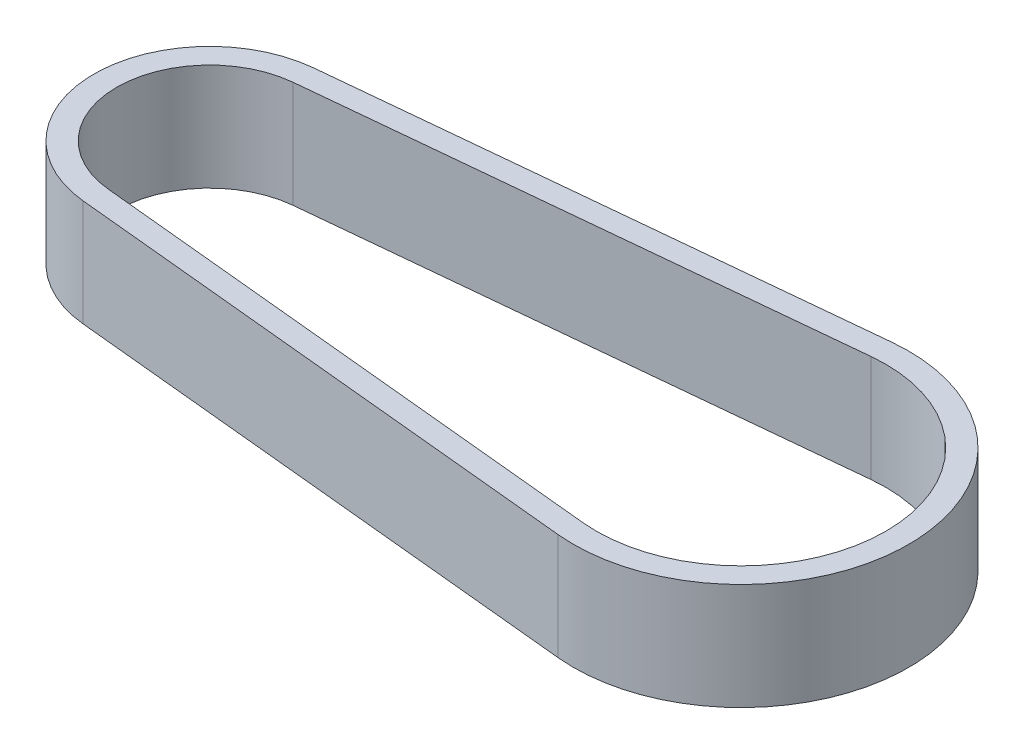
ISO-10303-21;
HEADER;
FILE_DESCRIPTION(('STEP AP214'),'2;1');
FILE_NAME('part.step','',(''),(''),'','','');
FILE_SCHEMA(('AUTOMOTIVE_DESIGN { 1 0 10303 214 1 1 1 1 }'));
ENDSEC;
DATA;
#1=APPLICATION_CONTEXT('core data for automotive mechanical design processes');
#2=APPLICATION_PROTOCOL_DEFINITION('international standard','automotive_design',2000,#1);
#3=PRODUCT_CONTEXT('',#1,'mechanical');
#4=PRODUCT('Part','Part','',(#3));
#5=PRODUCT_RELATED_PRODUCT_CATEGORY('part','',(#4));
#6=PRODUCT_DEFINITION_FORMATION('','',#4);
#7=PRODUCT_DEFINITION_CONTEXT('part definition',#1,'design');
#8=PRODUCT_DEFINITION('design','',#6,#7);
#9=PRODUCT_DEFINITION_SHAPE('','',#8);
#10=(LENGTH_UNIT() NAMED_UNIT(*) SI_UNIT(.MILLI.,.METRE.));
#11=(NAMED_UNIT(*) PLANE_ANGLE_UNIT() SI_UNIT($,.RADIAN.));
#12=(NAMED_UNIT(*) SI_UNIT($,.STERADIAN.) SOLID_ANGLE_UNIT());
#13=UNCERTAINTY_MEASURE_WITH_UNIT(LENGTH_MEASURE(1.E-05),#10,'distance_accuracy_value','');
#14=(GEOMETRIC_REPRESENTATION_CONTEXT(3) GLOBAL_UNCERTAINTY_ASSIGNED_CONTEXT((#13)) GLOBAL_UNIT_ASSIGNED_CONTEXT((#10,
#11,#12)) REPRESENTATION_CONTEXT('',''));
#15=CARTESIAN_POINT('',(0.,0.,0.));
#16=DIRECTION('',(0.,0.,1.));
#17=DIRECTION('',(1.,0.,0.));
#18=AXIS2_PLACEMENT_3D('',#15,#16,#17);
#19=CARTESIAN_POINT('',(0.,7.,0.));
#20=DIRECTION('',(0.,1.,0.));
#21=DIRECTION('',(0.,0.,1.));
#22=AXIS2_PLACEMENT_3D('',#19,#20,#21);
#23=PLANE('',#22);
#24=CARTESIAN_POINT('',(0.,7.,0.));
#25=DIRECTION('',(0.,1.,0.));
#26=DIRECTION('',(0.,0.,1.));
#27=AXIS2_PLACEMENT_3D('',#24,#25,#26);
#28=CIRCLE('',#27,7.6);
#29=CARTESIAN_POINT('',(-0.740401146131805,7.,-7.56384863299145));
#30=VERTEX_POINT('',#29);
#31=CARTESIAN_POINT('',(-0.740401146131804,7.,7.56384863299145));
#32=VERTEX_POINT('',#31);
#33=EDGE_CURVE('E134',#30,#32,#28,.T.);
#34=ORIENTED_EDGE('',*,*,#33,.T.);
#35=DIRECTION('',(0.995243241183086,0.,0.0974212034383954));
#36=VECTOR('',#35,1.);
#37=CARTESIAN_POINT('',(-0.740401146131804,7.,7.56384863299145));
#38=LINE('',#37,#36);
#39=CARTESIAN_POINT('',(33.8283667621776,7.,10.9476756530139));
#40=VERTEX_POINT('',#39);
#41=EDGE_CURVE('E137',#32,#40,#38,.T.);
#42=ORIENTED_EDGE('',*,*,#41,.T.);
#43=CARTESIAN_POINT('',(34.9,7.,0.));
#44=DIRECTION('',(0.,1.,0.));
#45=DIRECTION('',(0.,0.,1.));
#46=AXIS2_PLACEMENT_3D('',#43,#44,#45);
#47=CIRCLE('',#46,11.);
#48=CARTESIAN_POINT('',(33.8283667621777,7.,-10.9476756530139));
#49=VERTEX_POINT('',#48);
#50=EDGE_CURVE('E140',#40,#49,#47,.T.);
#51=ORIENTED_EDGE('',*,*,#50,.T.);
#52=DIRECTION('',(-0.995243241183086,0.,0.0974212034383955));
#53=VECTOR('',#52,1.);
#54=CARTESIAN_POINT('',(-0.740401146131805,7.,-7.56384863299145));
#55=LINE('',#54,#53);
#56=EDGE_CURVE('E142',#49,#30,#55,.T.);
#57=ORIENTED_EDGE('',*,*,#56,.T.);
#58=EDGE_LOOP('',(#34,#42,#51,#57));
#59=FACE_BOUND('',#58,.T.);
#60=DIRECTION('',(0.995243241183086,0.,0.0974212034383954));
#61=VECTOR('',#60,1.);
#62=CARTESIAN_POINT('',(-0.594269340974212,7.,6.07098377121683));
#63=LINE('',#62,#61);
#64=CARTESIAN_POINT('',(-0.594269340974212,7.,6.07098377121683));
#65=VERTEX_POINT('',#64);
#66=CARTESIAN_POINT('',(33.9744985673352,7.,9.45481079123932));
#67=VERTEX_POINT('',#66);
#68=EDGE_CURVE('E106',#65,#67,#63,.T.);
#69=ORIENTED_EDGE('',*,*,#68,.F.);
#70=CARTESIAN_POINT('',(0.,7.,0.));
#71=DIRECTION('',(0.,1.,0.));
#72=DIRECTION('',(0.,0.,1.));
#73=AXIS2_PLACEMENT_3D('',#70,#71,#72);
#74=CIRCLE('',#73,6.1);
#75=CARTESIAN_POINT('',(-0.594269340974212,7.,-6.07098377121683));
#76=VERTEX_POINT('',#75);
#77=EDGE_CURVE('E98',#76,#65,#74,.T.);
#78=ORIENTED_EDGE('',*,*,#77,.F.);
#79=DIRECTION('',(-0.995243241183086,0.,0.0974212034383954));
#80=VECTOR('',#79,1.);
#81=CARTESIAN_POINT('',(-0.594269340974212,7.,-6.07098377121683));
#82=LINE('',#81,#80);
#83=CARTESIAN_POINT('',(33.9744985673352,7.,-9.45481079123932));
#84=VERTEX_POINT('',#83);
#85=EDGE_CURVE('E120',#84,#76,#82,.T.);
#86=ORIENTED_EDGE('',*,*,#85,.F.);
#87=CARTESIAN_POINT('',(34.9,7.,0.));
#88=DIRECTION('',(0.,1.,0.));
#89=DIRECTION('',(0.,0.,1.));
#90=AXIS2_PLACEMENT_3D('',#87,#88,#89);
#91=CIRCLE('',#90,9.5);
#92=EDGE_CURVE('E118',#67,#84,#91,.T.);
#93=ORIENTED_EDGE('',*,*,#92,.F.);
#94=EDGE_LOOP('',(#69,#78,#86,#93));
#95=FACE_BOUND('',#94,.T.);
#96=ADVANCED_FACE('F33',(#59,#95),#23,.T.);
#97=CARTESIAN_POINT('',(0.,0.,0.));
#98=DIRECTION('',(0.,1.,0.));
#99=DIRECTION('',(0.,0.,1.));
#100=AXIS2_PLACEMENT_3D('',#97,#98,#99);
#101=PLANE('',#100);
#102=CARTESIAN_POINT('',(0.,0.,0.));
#103=DIRECTION('',(0.,1.,0.));
#104=DIRECTION('',(0.,0.,1.));
#105=AXIS2_PLACEMENT_3D('',#102,#103,#104);
#106=CIRCLE('',#105,7.6);
#107=CARTESIAN_POINT('',(-0.740401146131805,0.,-7.56384863299145));
#108=VERTEX_POINT('',#107);
#109=CARTESIAN_POINT('',(-0.740401146131804,0.,7.56384863299145));
#110=VERTEX_POINT('',#109);
#111=EDGE_CURVE('E114',#108,#110,#106,.T.);
#112=ORIENTED_EDGE('',*,*,#111,.F.);
#113=DIRECTION('',(-0.995243241183086,0.,0.0974212034383955));
#114=VECTOR('',#113,1.);
#115=CARTESIAN_POINT('',(-0.740401146131805,0.,-7.56384863299145));
#116=LINE('',#115,#114);
#117=CARTESIAN_POINT('',(33.8283667621777,0.,-10.9476756530139));
#118=VERTEX_POINT('',#117);
#119=EDGE_CURVE('E138',#118,#108,#116,.T.);
#120=ORIENTED_EDGE('',*,*,#119,.F.);
#121=CARTESIAN_POINT('',(34.9,0.,0.));
#122=DIRECTION('',(0.,1.,0.));
#123=DIRECTION('',(0.,0.,1.));
#124=AXIS2_PLACEMENT_3D('',#121,#122,#123);
#125=CIRCLE('',#124,11.);
#126=CARTESIAN_POINT('',(33.8283667621776,0.,10.9476756530139));
#127=VERTEX_POINT('',#126);
#128=EDGE_CURVE('E149',#127,#118,#125,.T.);
#129=ORIENTED_EDGE('',*,*,#128,.F.);
#130=DIRECTION('',(0.995243241183086,0.,0.0974212034383954));
#131=VECTOR('',#130,1.);
#132=CARTESIAN_POINT('',(-0.740401146131804,0.,7.56384863299145));
#133=LINE('',#132,#131);
#134=EDGE_CURVE('E147',#110,#127,#133,.T.);
#135=ORIENTED_EDGE('',*,*,#134,.F.);
#136=EDGE_LOOP('',(#112,#120,#129,#135));
#137=FACE_BOUND('',#136,.T.);
#138=CARTESIAN_POINT('',(0.,0.,0.));
#139=DIRECTION('',(0.,1.,0.));
#140=DIRECTION('',(0.,0.,1.));
#141=AXIS2_PLACEMENT_3D('',#138,#139,#140);
#142=CIRCLE('',#141,6.1);
#143=CARTESIAN_POINT('',(-0.594269340974212,0.,-6.07098377121683));
#144=VERTEX_POINT('',#143);
#145=CARTESIAN_POINT('',(-0.594269340974212,0.,6.07098377121683));
#146=VERTEX_POINT('',#145);
#147=EDGE_CURVE('E56',#144,#146,#142,.T.);
#148=ORIENTED_EDGE('',*,*,#147,.T.);
#149=DIRECTION('',(0.995243241183086,0.,0.0974212034383954));
#150=VECTOR('',#149,1.);
#151=CARTESIAN_POINT('',(-0.594269340974212,0.,6.07098377121683));
#152=LINE('',#151,#150);
#153=CARTESIAN_POINT('',(33.9744985673352,0.,9.45481079123932));
#154=VERTEX_POINT('',#153);
#155=EDGE_CURVE('E113',#146,#154,#152,.T.);
#156=ORIENTED_EDGE('',*,*,#155,.T.);
#157=CARTESIAN_POINT('',(34.9,0.,0.));
#158=DIRECTION('',(0.,1.,0.));
#159=DIRECTION('',(0.,0.,1.));
#160=AXIS2_PLACEMENT_3D('',#157,#158,#159);
#161=CIRCLE('',#160,9.5);
#162=CARTESIAN_POINT('',(33.9744985673352,0.,-9.45481079123932));
#163=VERTEX_POINT('',#162);
#164=EDGE_CURVE('E126',#154,#163,#161,.T.);
#165=ORIENTED_EDGE('',*,*,#164,.T.);
#166=DIRECTION('',(-0.995243241183086,0.,0.0974212034383954));
#167=VECTOR('',#166,1.);
#168=CARTESIAN_POINT('',(-0.594269340974212,0.,-6.07098377121683));
#169=LINE('',#168,#167);
#170=EDGE_CURVE('E107',#163,#144,#169,.T.);
#171=ORIENTED_EDGE('',*,*,#170,.T.);
#172=EDGE_LOOP('',(#148,#156,#165,#171));
#173=FACE_BOUND('',#172,.T.);
#174=ADVANCED_FACE('F167',(#137,#173),#101,.F.);
#175=CARTESIAN_POINT('',(0.,7.,0.));
#176=DIRECTION('',(0.,-1.,0.));
#177=DIRECTION('',(0.,0.,-1.));
#178=AXIS2_PLACEMENT_3D('',#175,#176,#177);
#179=CYLINDRICAL_SURFACE('',#178,7.6);
#180=ORIENTED_EDGE('',*,*,#111,.T.);
#181=DIRECTION('',(0.,-1.,0.));
#182=VECTOR('',#181,1.);
#183=CARTESIAN_POINT('',(-0.740401146131804,7.,7.56384863299145));
#184=LINE('',#183,#182);
#185=EDGE_CURVE('E11',#32,#110,#184,.T.);
#186=ORIENTED_EDGE('',*,*,#185,.F.);
#187=ORIENTED_EDGE('',*,*,#33,.F.);
#188=DIRECTION('',(0.,-1.,0.));
#189=VECTOR('',#188,1.);
#190=CARTESIAN_POINT('',(-0.740401146131805,7.,-7.56384863299145));
#191=LINE('',#190,#189);
#192=EDGE_CURVE('E144',#30,#108,#191,.T.);
#193=ORIENTED_EDGE('',*,*,#192,.T.);
#194=EDGE_LOOP('',(#180,#186,#187,#193));
#195=FACE_BOUND('',#194,.T.);
#196=ADVANCED_FACE('F35',(#195),#179,.T.);
#197=CARTESIAN_POINT('',(-0.740401146131804,7.,7.56384863299145));
#198=DIRECTION('',(0.0974212034383954,0.,-0.995243241183086));
#199=DIRECTION('',(-0.995243241183086,0.,-0.0974212034383954));
#200=AXIS2_PLACEMENT_3D('',#197,#198,#199);
#201=PLANE('',#200);
#202=ORIENTED_EDGE('',*,*,#134,.T.);
#203=DIRECTION('',(0.,-1.,0.));
#204=VECTOR('',#203,1.);
#205=CARTESIAN_POINT('',(33.8283667621776,7.,10.9476756530139));
#206=LINE('',#205,#204);
#207=EDGE_CURVE('E41',#40,#127,#206,.T.);
#208=ORIENTED_EDGE('',*,*,#207,.F.);
#209=ORIENTED_EDGE('',*,*,#41,.F.);
#210=ORIENTED_EDGE('',*,*,#185,.T.);
#211=EDGE_LOOP('',(#202,#208,#209,#210));
#212=FACE_BOUND('',#211,.T.);
#213=ADVANCED_FACE('F177',(#212),#201,.F.);
#214=CARTESIAN_POINT('',(34.9,7.,0.));
#215=DIRECTION('',(0.,-1.,0.));
#216=DIRECTION('',(0.,0.,-1.));
#217=AXIS2_PLACEMENT_3D('',#214,#215,#216);
#218=CYLINDRICAL_SURFACE('',#217,11.);
#219=ORIENTED_EDGE('',*,*,#128,.T.);
#220=DIRECTION('',(0.,-1.,0.));
#221=VECTOR('',#220,1.);
#222=CARTESIAN_POINT('',(33.8283667621777,7.,-10.9476756530139));
#223=LINE('',#222,#221);
#224=EDGE_CURVE('E154',#49,#118,#223,.T.);
#225=ORIENTED_EDGE('',*,*,#224,.F.);
#226=ORIENTED_EDGE('',*,*,#50,.F.);
#227=ORIENTED_EDGE('',*,*,#207,.T.);
#228=EDGE_LOOP('',(#219,#225,#226,#227));
#229=FACE_BOUND('',#228,.T.);
#230=ADVANCED_FACE('F161',(#229),#218,.T.);
#231=CARTESIAN_POINT('',(-0.740401146131805,7.,-7.56384863299145));
#232=DIRECTION('',(0.0974212034383954,0.,0.995243241183086));
#233=DIRECTION('',(0.995243241183086,0.,-0.0974212034383955));
#234=AXIS2_PLACEMENT_3D('',#231,#232,#233);
#235=PLANE('',#234);
#236=ORIENTED_EDGE('',*,*,#119,.T.);
#237=ORIENTED_EDGE('',*,*,#192,.F.);
#238=ORIENTED_EDGE('',*,*,#56,.F.);
#239=ORIENTED_EDGE('',*,*,#224,.T.);
#240=EDGE_LOOP('',(#236,#237,#238,#239));
#241=FACE_BOUND('',#240,.T.);
#242=ADVANCED_FACE('F171',(#241),#235,.F.);
#243=CARTESIAN_POINT('',(0.,7.,0.));
#244=DIRECTION('',(0.,-1.,0.));
#245=DIRECTION('',(0.,0.,-1.));
#246=AXIS2_PLACEMENT_3D('',#243,#244,#245);
#247=CYLINDRICAL_SURFACE('',#246,6.1);
#248=ORIENTED_EDGE('',*,*,#147,.F.);
#249=DIRECTION('',(0.,-1.,0.));
#250=VECTOR('',#249,1.);
#251=CARTESIAN_POINT('',(-0.594269340974212,7.,-6.07098377121683));
#252=LINE('',#251,#250);
#253=EDGE_CURVE('E102',#76,#144,#252,.T.);
#254=ORIENTED_EDGE('',*,*,#253,.F.);
#255=ORIENTED_EDGE('',*,*,#77,.T.);
#256=DIRECTION('',(0.,-1.,0.));
#257=VECTOR('',#256,1.);
#258=CARTESIAN_POINT('',(-0.594269340974212,7.,6.07098377121683));
#259=LINE('',#258,#257);
#260=EDGE_CURVE('E101',#65,#146,#259,.T.);
#261=ORIENTED_EDGE('',*,*,#260,.T.);
#262=EDGE_LOOP('',(#248,#254,#255,#261));
#263=FACE_BOUND('',#262,.T.);
#264=ADVANCED_FACE('F100',(#263),#247,.F.);
#265=CARTESIAN_POINT('',(-0.594269340974212,7.,6.07098377121683));
#266=DIRECTION('',(0.0974212034383954,0.,-0.995243241183086));
#267=DIRECTION('',(-0.995243241183086,0.,-0.0974212034383954));
#268=AXIS2_PLACEMENT_3D('',#265,#266,#267);
#269=PLANE('',#268);
#270=ORIENTED_EDGE('',*,*,#155,.F.);
#271=ORIENTED_EDGE('',*,*,#260,.F.);
#272=ORIENTED_EDGE('',*,*,#68,.T.);
#273=DIRECTION('',(0.,-1.,0.));
#274=VECTOR('',#273,1.);
#275=CARTESIAN_POINT('',(33.9744985673352,7.,9.45481079123932));
#276=LINE('',#275,#274);
#277=EDGE_CURVE('E115',#67,#154,#276,.T.);
#278=ORIENTED_EDGE('',*,*,#277,.T.);
#279=EDGE_LOOP('',(#270,#271,#272,#278));
#280=FACE_BOUND('',#279,.T.);
#281=ADVANCED_FACE('F110',(#280),#269,.T.);
#282=CARTESIAN_POINT('',(34.9,7.,0.));
#283=DIRECTION('',(0.,-1.,0.));
#284=DIRECTION('',(0.,0.,-1.));
#285=AXIS2_PLACEMENT_3D('',#282,#283,#284);
#286=CYLINDRICAL_SURFACE('',#285,9.5);
#287=ORIENTED_EDGE('',*,*,#164,.F.);
#288=ORIENTED_EDGE('',*,*,#277,.F.);
#289=ORIENTED_EDGE('',*,*,#92,.T.);
#290=DIRECTION('',(0.,-1.,0.));
#291=VECTOR('',#290,1.);
#292=CARTESIAN_POINT('',(33.9744985673352,7.,-9.45481079123932));
#293=LINE('',#292,#291);
#294=EDGE_CURVE('E48',#84,#163,#293,.T.);
#295=ORIENTED_EDGE('',*,*,#294,.T.);
#296=EDGE_LOOP('',(#287,#288,#289,#295));
#297=FACE_BOUND('',#296,.T.);
#298=ADVANCED_FACE('F200',(#297),#286,.F.);
#299=CARTESIAN_POINT('',(-0.594269340974212,7.,-6.07098377121683));
#300=DIRECTION('',(0.0974212034383954,0.,0.995243241183086));
#301=DIRECTION('',(0.995243241183086,0.,-0.0974212034383954));
#302=AXIS2_PLACEMENT_3D('',#299,#300,#301);
#303=PLANE('',#302);
#304=ORIENTED_EDGE('',*,*,#170,.F.);
#305=ORIENTED_EDGE('',*,*,#294,.F.);
#306=ORIENTED_EDGE('',*,*,#85,.T.);
#307=ORIENTED_EDGE('',*,*,#253,.T.);
#308=EDGE_LOOP('',(#304,#305,#306,#307));
#309=FACE_BOUND('',#308,.T.);
#310=ADVANCED_FACE('F204',(#309),#303,.T.);
#311=CLOSED_SHELL('',(#96,#174,#196,#213,#230,#242,#264,#281,#298,#310));
#312=MANIFOLD_SOLID_BREP('B2',#311);
#313=ADVANCED_BREP_SHAPE_REPRESENTATION('',(#18,#312),#14);
#314=SHAPE_DEFINITION_REPRESENTATION(#9,#313);
ENDSEC;
END-ISO-10303-21;
